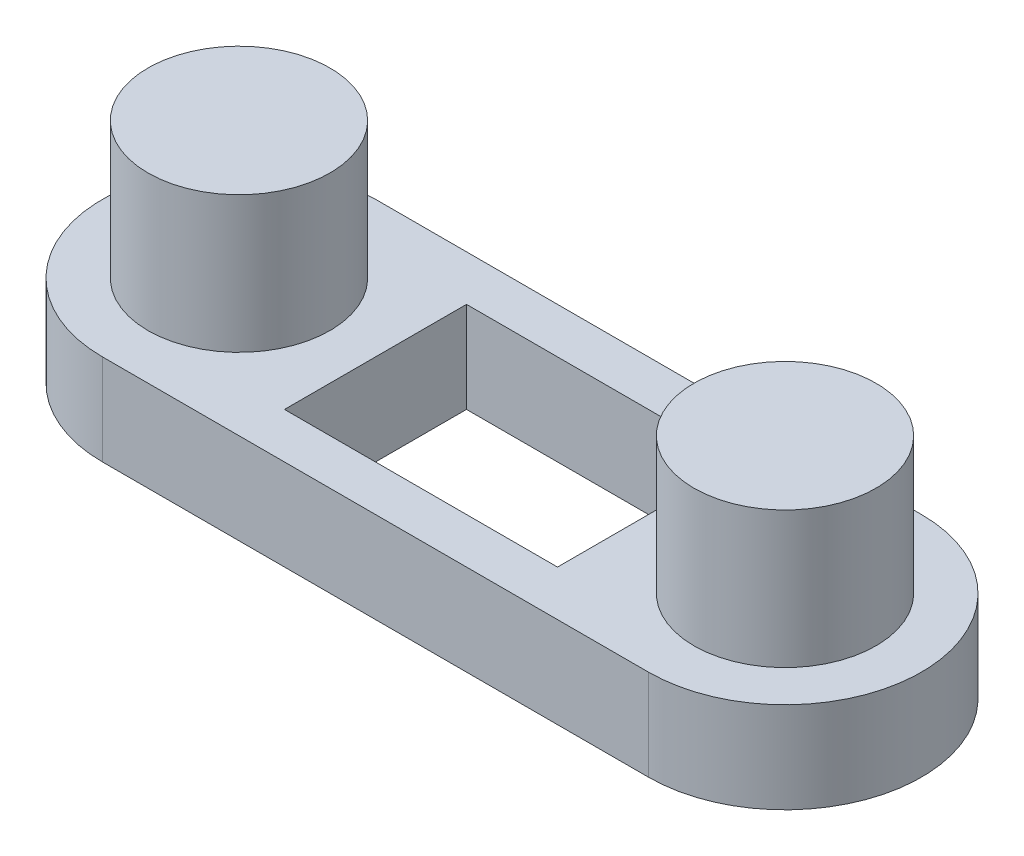
ISO-10303-21;
HEADER;
FILE_DESCRIPTION(('STEP AP214'),'2;1');
FILE_NAME('part.step','',(''),(''),'','','');
FILE_SCHEMA(('AUTOMOTIVE_DESIGN { 1 0 10303 214 1 1 1 1 }'));
ENDSEC;
DATA;
#1=APPLICATION_CONTEXT('core data for automotive mechanical design processes');
#2=APPLICATION_PROTOCOL_DEFINITION('international standard','automotive_design',2000,#1);
#3=PRODUCT_CONTEXT('',#1,'mechanical');
#4=PRODUCT('Part','Part','',(#3));
#5=PRODUCT_RELATED_PRODUCT_CATEGORY('part','',(#4));
#6=PRODUCT_DEFINITION_FORMATION('','',#4);
#7=PRODUCT_DEFINITION_CONTEXT('part definition',#1,'design');
#8=PRODUCT_DEFINITION('design','',#6,#7);
#9=PRODUCT_DEFINITION_SHAPE('','',#8);
#10=(LENGTH_UNIT() NAMED_UNIT(*) SI_UNIT(.MILLI.,.METRE.));
#11=(NAMED_UNIT(*) PLANE_ANGLE_UNIT() SI_UNIT($,.RADIAN.));
#12=(NAMED_UNIT(*) SI_UNIT($,.STERADIAN.) SOLID_ANGLE_UNIT());
#13=UNCERTAINTY_MEASURE_WITH_UNIT(LENGTH_MEASURE(1.E-05),#10,'distance_accuracy_value','');
#14=(GEOMETRIC_REPRESENTATION_CONTEXT(3) GLOBAL_UNCERTAINTY_ASSIGNED_CONTEXT((#13)) GLOBAL_UNIT_ASSIGNED_CONTEXT((#10,
#11,#12)) REPRESENTATION_CONTEXT('',''));
#15=CARTESIAN_POINT('',(0.,0.,0.));
#16=DIRECTION('',(0.,0.,1.));
#17=DIRECTION('',(1.,0.,0.));
#18=AXIS2_PLACEMENT_3D('',#15,#16,#17);
#19=CARTESIAN_POINT('',(-30.,10.,0.));
#20=DIRECTION('',(0.,-1.,0.));
#21=DIRECTION('',(0.,0.,-1.));
#22=AXIS2_PLACEMENT_3D('',#19,#20,#21);
#23=CYLINDRICAL_SURFACE('',#22,15.);
#24=CARTESIAN_POINT('',(-30.,0.,0.));
#25=DIRECTION('',(0.,1.,0.));
#26=DIRECTION('',(0.,0.,1.));
#27=AXIS2_PLACEMENT_3D('',#24,#25,#26);
#28=CIRCLE('',#27,15.);
#29=CARTESIAN_POINT('',(-30.,0.,-15.));
#30=VERTEX_POINT('',#29);
#31=CARTESIAN_POINT('',(-30.,0.,15.));
#32=VERTEX_POINT('',#31);
#33=EDGE_CURVE('E136',#30,#32,#28,.T.);
#34=ORIENTED_EDGE('',*,*,#33,.T.);
#35=DIRECTION('',(0.,-1.,0.));
#36=VECTOR('',#35,1.);
#37=CARTESIAN_POINT('',(-30.,10.,15.));
#38=LINE('',#37,#36);
#39=CARTESIAN_POINT('',(-30.,10.,15.));
#40=VERTEX_POINT('',#39);
#41=EDGE_CURVE('E11',#40,#32,#38,.T.);
#42=ORIENTED_EDGE('',*,*,#41,.F.);
#43=CARTESIAN_POINT('',(-30.,10.,0.));
#44=DIRECTION('',(0.,1.,0.));
#45=DIRECTION('',(0.,0.,1.));
#46=AXIS2_PLACEMENT_3D('',#43,#44,#45);
#47=CIRCLE('',#46,15.);
#48=CARTESIAN_POINT('',(-30.,10.,-15.));
#49=VERTEX_POINT('',#48);
#50=EDGE_CURVE('E140',#49,#40,#47,.T.);
#51=ORIENTED_EDGE('',*,*,#50,.F.);
#52=DIRECTION('',(0.,-1.,0.));
#53=VECTOR('',#52,1.);
#54=CARTESIAN_POINT('',(-30.,10.,-15.));
#55=LINE('',#54,#53);
#56=EDGE_CURVE('E150',#49,#30,#55,.T.);
#57=ORIENTED_EDGE('',*,*,#56,.T.);
#58=EDGE_LOOP('',(#34,#42,#51,#57));
#59=FACE_BOUND('',#58,.T.);
#60=ADVANCED_FACE('F35',(#59),#23,.T.);
#61=CARTESIAN_POINT('',(30.,10.,15.));
#62=DIRECTION('',(0.,0.,-1.));
#63=DIRECTION('',(-1.,0.,0.));
#64=AXIS2_PLACEMENT_3D('',#61,#62,#63);
#65=PLANE('',#64);
#66=DIRECTION('',(1.,0.,0.));
#67=VECTOR('',#66,1.);
#68=CARTESIAN_POINT('',(30.,0.,15.));
#69=LINE('',#68,#67);
#70=CARTESIAN_POINT('',(30.,0.,15.));
#71=VERTEX_POINT('',#70);
#72=EDGE_CURVE('E153',#32,#71,#69,.T.);
#73=ORIENTED_EDGE('',*,*,#72,.T.);
#74=DIRECTION('',(0.,-1.,0.));
#75=VECTOR('',#74,1.);
#76=CARTESIAN_POINT('',(30.,10.,15.));
#77=LINE('',#76,#75);
#78=CARTESIAN_POINT('',(30.,10.,15.));
#79=VERTEX_POINT('',#78);
#80=EDGE_CURVE('E42',#79,#71,#77,.T.);
#81=ORIENTED_EDGE('',*,*,#80,.F.);
#82=DIRECTION('',(1.,0.,0.));
#83=VECTOR('',#82,1.);
#84=CARTESIAN_POINT('',(30.,10.,15.));
#85=LINE('',#84,#83);
#86=EDGE_CURVE('E143',#40,#79,#85,.T.);
#87=ORIENTED_EDGE('',*,*,#86,.F.);
#88=ORIENTED_EDGE('',*,*,#41,.T.);
#89=EDGE_LOOP('',(#73,#81,#87,#88));
#90=FACE_BOUND('',#89,.T.);
#91=ADVANCED_FACE('F181',(#90),#65,.F.);
#92=CARTESIAN_POINT('',(30.,10.,0.));
#93=DIRECTION('',(0.,-1.,0.));
#94=DIRECTION('',(0.,0.,-1.));
#95=AXIS2_PLACEMENT_3D('',#92,#93,#94);
#96=CYLINDRICAL_SURFACE('',#95,15.);
#97=CARTESIAN_POINT('',(30.,0.,0.));
#98=DIRECTION('',(0.,1.,0.));
#99=DIRECTION('',(0.,0.,1.));
#100=AXIS2_PLACEMENT_3D('',#97,#98,#99);
#101=CIRCLE('',#100,15.);
#102=CARTESIAN_POINT('',(30.,0.,-15.));
#103=VERTEX_POINT('',#102);
#104=EDGE_CURVE('E155',#71,#103,#101,.T.);
#105=ORIENTED_EDGE('',*,*,#104,.T.);
#106=DIRECTION('',(0.,-1.,0.));
#107=VECTOR('',#106,1.);
#108=CARTESIAN_POINT('',(30.,10.,-15.));
#109=LINE('',#108,#107);
#110=CARTESIAN_POINT('',(30.,10.,-15.));
#111=VERTEX_POINT('',#110);
#112=EDGE_CURVE('E160',#111,#103,#109,.T.);
#113=ORIENTED_EDGE('',*,*,#112,.F.);
#114=CARTESIAN_POINT('',(30.,10.,0.));
#115=DIRECTION('',(0.,1.,0.));
#116=DIRECTION('',(0.,0.,1.));
#117=AXIS2_PLACEMENT_3D('',#114,#115,#116);
#118=CIRCLE('',#117,15.);
#119=EDGE_CURVE('E146',#79,#111,#118,.T.);
#120=ORIENTED_EDGE('',*,*,#119,.F.);
#121=ORIENTED_EDGE('',*,*,#80,.T.);
#122=EDGE_LOOP('',(#105,#113,#120,#121));
#123=FACE_BOUND('',#122,.T.);
#124=ADVANCED_FACE('F167',(#123),#96,.T.);
#125=CARTESIAN_POINT('',(30.,10.,-15.));
#126=DIRECTION('',(0.,0.,1.));
#127=DIRECTION('',(1.,0.,0.));
#128=AXIS2_PLACEMENT_3D('',#125,#126,#127);
#129=PLANE('',#128);
#130=DIRECTION('',(-1.,0.,0.));
#131=VECTOR('',#130,1.);
#132=CARTESIAN_POINT('',(30.,0.,-15.));
#133=LINE('',#132,#131);
#134=EDGE_CURVE('E144',#103,#30,#133,.T.);
#135=ORIENTED_EDGE('',*,*,#134,.T.);
#136=ORIENTED_EDGE('',*,*,#56,.F.);
#137=DIRECTION('',(-1.,0.,0.));
#138=VECTOR('',#137,1.);
#139=CARTESIAN_POINT('',(30.,10.,-15.));
#140=LINE('',#139,#138);
#141=EDGE_CURVE('E148',#111,#49,#140,.T.);
#142=ORIENTED_EDGE('',*,*,#141,.F.);
#143=ORIENTED_EDGE('',*,*,#112,.T.);
#144=EDGE_LOOP('',(#135,#136,#142,#143));
#145=FACE_BOUND('',#144,.T.);
#146=ADVANCED_FACE('F174',(#145),#129,.F.);
#147=CARTESIAN_POINT('',(-30.,10.,0.));
#148=DIRECTION('',(0.,1.,0.));
#149=DIRECTION('',(0.,0.,1.));
#150=AXIS2_PLACEMENT_3D('',#147,#148,#149);
#151=PLANE('',#150);
#152=CARTESIAN_POINT('',(-30.,10.,0.));
#153=DIRECTION('',(0.,1.,0.));
#154=DIRECTION('',(0.,0.,1.));
#155=AXIS2_PLACEMENT_3D('',#152,#153,#154);
#156=CIRCLE('',#155,9.99999999999999);
#157=CARTESIAN_POINT('',(-30.,10.,10.));
#158=VERTEX_POINT('',#157);
#159=EDGE_CURVE('E227',#158,#158,#156,.T.);
#160=ORIENTED_EDGE('',*,*,#159,.F.);
#161=EDGE_LOOP('',(#160));
#162=FACE_BOUND('',#161,.T.);
#163=CARTESIAN_POINT('',(30.,10.,0.));
#164=DIRECTION('',(0.,1.,0.));
#165=DIRECTION('',(0.,0.,1.));
#166=AXIS2_PLACEMENT_3D('',#163,#164,#165);
#167=CIRCLE('',#166,10.);
#168=CARTESIAN_POINT('',(30.,10.,9.99999999999999));
#169=VERTEX_POINT('',#168);
#170=EDGE_CURVE('E123',#169,#169,#167,.T.);
#171=ORIENTED_EDGE('',*,*,#170,.F.);
#172=EDGE_LOOP('',(#171));
#173=FACE_BOUND('',#172,.T.);
#174=DIRECTION('',(0.,0.,1.));
#175=VECTOR('',#174,1.);
#176=CARTESIAN_POINT('',(-15.,10.,10.));
#177=LINE('',#176,#175);
#178=CARTESIAN_POINT('',(-15.,10.,-10.));
#179=VERTEX_POINT('',#178);
#180=CARTESIAN_POINT('',(-15.,10.,10.));
#181=VERTEX_POINT('',#180);
#182=EDGE_CURVE('E49',#179,#181,#177,.T.);
#183=ORIENTED_EDGE('',*,*,#182,.F.);
#184=DIRECTION('',(-1.,0.,0.));
#185=VECTOR('',#184,1.);
#186=CARTESIAN_POINT('',(15.,10.,-10.));
#187=LINE('',#186,#185);
#188=CARTESIAN_POINT('',(15.,10.,-10.));
#189=VERTEX_POINT('',#188);
#190=EDGE_CURVE('E117',#189,#179,#187,.T.);
#191=ORIENTED_EDGE('',*,*,#190,.F.);
#192=DIRECTION('',(0.,0.,-1.));
#193=VECTOR('',#192,1.);
#194=CARTESIAN_POINT('',(15.,10.,10.));
#195=LINE('',#194,#193);
#196=CARTESIAN_POINT('',(15.,10.,10.));
#197=VERTEX_POINT('',#196);
#198=EDGE_CURVE('E120',#197,#189,#195,.T.);
#199=ORIENTED_EDGE('',*,*,#198,.F.);
#200=DIRECTION('',(1.,0.,0.));
#201=VECTOR('',#200,1.);
#202=CARTESIAN_POINT('',(15.,10.,10.));
#203=LINE('',#202,#201);
#204=EDGE_CURVE('E129',#181,#197,#203,.T.);
#205=ORIENTED_EDGE('',*,*,#204,.F.);
#206=EDGE_LOOP('',(#183,#191,#199,#205));
#207=FACE_BOUND('',#206,.T.);
#208=ORIENTED_EDGE('',*,*,#50,.T.);
#209=ORIENTED_EDGE('',*,*,#86,.T.);
#210=ORIENTED_EDGE('',*,*,#119,.T.);
#211=ORIENTED_EDGE('',*,*,#141,.T.);
#212=EDGE_LOOP('',(#208,#209,#210,#211));
#213=FACE_BOUND('',#212,.T.);
#214=ADVANCED_FACE('F180',(#162,#173,#207,#213),#151,.T.);
#215=CARTESIAN_POINT('',(-30.,0.,0.));
#216=DIRECTION('',(0.,1.,0.));
#217=DIRECTION('',(0.,0.,1.));
#218=AXIS2_PLACEMENT_3D('',#215,#216,#217);
#219=PLANE('',#218);
#220=DIRECTION('',(-1.,0.,0.));
#221=VECTOR('',#220,1.);
#222=CARTESIAN_POINT('',(15.,0.,-10.));
#223=LINE('',#222,#221);
#224=CARTESIAN_POINT('',(15.,0.,-10.));
#225=VERTEX_POINT('',#224);
#226=CARTESIAN_POINT('',(-15.,0.,-10.));
#227=VERTEX_POINT('',#226);
#228=EDGE_CURVE('E107',#225,#227,#223,.T.);
#229=ORIENTED_EDGE('',*,*,#228,.T.);
#230=DIRECTION('',(0.,0.,1.));
#231=VECTOR('',#230,1.);
#232=CARTESIAN_POINT('',(-15.,0.,10.));
#233=LINE('',#232,#231);
#234=CARTESIAN_POINT('',(-15.,0.,10.));
#235=VERTEX_POINT('',#234);
#236=EDGE_CURVE('E101',#227,#235,#233,.T.);
#237=ORIENTED_EDGE('',*,*,#236,.T.);
#238=DIRECTION('',(1.,0.,0.));
#239=VECTOR('',#238,1.);
#240=CARTESIAN_POINT('',(15.,0.,10.));
#241=LINE('',#240,#239);
#242=CARTESIAN_POINT('',(15.,0.,10.));
#243=VERTEX_POINT('',#242);
#244=EDGE_CURVE('E110',#235,#243,#241,.T.);
#245=ORIENTED_EDGE('',*,*,#244,.T.);
#246=DIRECTION('',(0.,0.,-1.));
#247=VECTOR('',#246,1.);
#248=CARTESIAN_POINT('',(15.,0.,10.));
#249=LINE('',#248,#247);
#250=EDGE_CURVE('E57',#243,#225,#249,.T.);
#251=ORIENTED_EDGE('',*,*,#250,.T.);
#252=EDGE_LOOP('',(#229,#237,#245,#251));
#253=FACE_BOUND('',#252,.T.);
#254=ORIENTED_EDGE('',*,*,#33,.F.);
#255=ORIENTED_EDGE('',*,*,#134,.F.);
#256=ORIENTED_EDGE('',*,*,#104,.F.);
#257=ORIENTED_EDGE('',*,*,#72,.F.);
#258=EDGE_LOOP('',(#254,#255,#256,#257));
#259=FACE_BOUND('',#258,.T.);
#260=ADVANCED_FACE('F114',(#253,#259),#219,.F.);
#261=CARTESIAN_POINT('',(-15.,0.,10.));
#262=DIRECTION('',(-1.,0.,0.));
#263=DIRECTION('',(0.,0.,1.));
#264=AXIS2_PLACEMENT_3D('',#261,#262,#263);
#265=PLANE('',#264);
#266=ORIENTED_EDGE('',*,*,#182,.T.);
#267=DIRECTION('',(0.,1.,0.));
#268=VECTOR('',#267,1.);
#269=CARTESIAN_POINT('',(-15.,0.,10.));
#270=LINE('',#269,#268);
#271=EDGE_CURVE('E97',#235,#181,#270,.T.);
#272=ORIENTED_EDGE('',*,*,#271,.F.);
#273=ORIENTED_EDGE('',*,*,#236,.F.);
#274=DIRECTION('',(0.,1.,0.));
#275=VECTOR('',#274,1.);
#276=CARTESIAN_POINT('',(-15.,0.,-10.));
#277=LINE('',#276,#275);
#278=EDGE_CURVE('E134',#227,#179,#277,.T.);
#279=ORIENTED_EDGE('',*,*,#278,.T.);
#280=EDGE_LOOP('',(#266,#272,#273,#279));
#281=FACE_BOUND('',#280,.T.);
#282=ADVANCED_FACE('F99',(#281),#265,.F.);
#283=CARTESIAN_POINT('',(15.,0.,-10.));
#284=DIRECTION('',(0.,0.,-1.));
#285=DIRECTION('',(-1.,0.,0.));
#286=AXIS2_PLACEMENT_3D('',#283,#284,#285);
#287=PLANE('',#286);
#288=ORIENTED_EDGE('',*,*,#190,.T.);
#289=ORIENTED_EDGE('',*,*,#278,.F.);
#290=ORIENTED_EDGE('',*,*,#228,.F.);
#291=DIRECTION('',(0.,1.,0.));
#292=VECTOR('',#291,1.);
#293=CARTESIAN_POINT('',(15.,0.,-10.));
#294=LINE('',#293,#292);
#295=EDGE_CURVE('E137',#225,#189,#294,.T.);
#296=ORIENTED_EDGE('',*,*,#295,.T.);
#297=EDGE_LOOP('',(#288,#289,#290,#296));
#298=FACE_BOUND('',#297,.T.);
#299=ADVANCED_FACE('F198',(#298),#287,.F.);
#300=CARTESIAN_POINT('',(15.,0.,10.));
#301=DIRECTION('',(1.,0.,0.));
#302=DIRECTION('',(0.,0.,-1.));
#303=AXIS2_PLACEMENT_3D('',#300,#301,#302);
#304=PLANE('',#303);
#305=ORIENTED_EDGE('',*,*,#198,.T.);
#306=ORIENTED_EDGE('',*,*,#295,.F.);
#307=ORIENTED_EDGE('',*,*,#250,.F.);
#308=DIRECTION('',(0.,1.,0.));
#309=VECTOR('',#308,1.);
#310=CARTESIAN_POINT('',(15.,0.,10.));
#311=LINE('',#310,#309);
#312=EDGE_CURVE('E106',#243,#197,#311,.T.);
#313=ORIENTED_EDGE('',*,*,#312,.T.);
#314=EDGE_LOOP('',(#305,#306,#307,#313));
#315=FACE_BOUND('',#314,.T.);
#316=ADVANCED_FACE('F202',(#315),#304,.F.);
#317=CARTESIAN_POINT('',(15.,0.,10.));
#318=DIRECTION('',(0.,0.,1.));
#319=DIRECTION('',(1.,0.,0.));
#320=AXIS2_PLACEMENT_3D('',#317,#318,#319);
#321=PLANE('',#320);
#322=ORIENTED_EDGE('',*,*,#204,.T.);
#323=ORIENTED_EDGE('',*,*,#312,.F.);
#324=ORIENTED_EDGE('',*,*,#244,.F.);
#325=ORIENTED_EDGE('',*,*,#271,.T.);
#326=EDGE_LOOP('',(#322,#323,#324,#325));
#327=FACE_BOUND('',#326,.T.);
#328=ADVANCED_FACE('F111',(#327),#321,.F.);
#329=CARTESIAN_POINT('',(30.,25.,0.));
#330=DIRECTION('',(0.,-1.,0.));
#331=DIRECTION('',(0.,0.,-1.));
#332=AXIS2_PLACEMENT_3D('',#329,#330,#331);
#333=CYLINDRICAL_SURFACE('',#332,10.);
#334=CARTESIAN_POINT('',(30.,25.,0.));
#335=DIRECTION('',(0.,1.,0.));
#336=DIRECTION('',(0.,0.,1.));
#337=AXIS2_PLACEMENT_3D('',#334,#335,#336);
#338=CIRCLE('',#337,10.);
#339=CARTESIAN_POINT('',(30.,25.,9.99999999999999));
#340=VERTEX_POINT('',#339);
#341=EDGE_CURVE('E130',#340,#340,#338,.T.);
#342=ORIENTED_EDGE('',*,*,#341,.F.);
#343=EDGE_LOOP('',(#342));
#344=FACE_BOUND('',#343,.T.);
#345=ORIENTED_EDGE('',*,*,#170,.T.);
#346=EDGE_LOOP('',(#345));
#347=FACE_BOUND('',#346,.T.);
#348=ADVANCED_FACE('F201',(#344,#347),#333,.T.);
#349=CARTESIAN_POINT('',(30.,25.,0.));
#350=DIRECTION('',(0.,1.,0.));
#351=DIRECTION('',(0.,0.,1.));
#352=AXIS2_PLACEMENT_3D('',#349,#350,#351);
#353=PLANE('',#352);
#354=ORIENTED_EDGE('',*,*,#341,.T.);
#355=EDGE_LOOP('',(#354));
#356=FACE_BOUND('',#355,.T.);
#357=ADVANCED_FACE('F210',(#356),#353,.T.);
#358=CARTESIAN_POINT('',(-30.,25.,0.));
#359=DIRECTION('',(0.,-1.,0.));
#360=DIRECTION('',(0.,0.,-1.));
#361=AXIS2_PLACEMENT_3D('',#358,#359,#360);
#362=CYLINDRICAL_SURFACE('',#361,9.99999999999999);
#363=CARTESIAN_POINT('',(-30.,25.,0.));
#364=DIRECTION('',(0.,1.,0.));
#365=DIRECTION('',(0.,0.,1.));
#366=AXIS2_PLACEMENT_3D('',#363,#364,#365);
#367=CIRCLE('',#366,9.99999999999999);
#368=CARTESIAN_POINT('',(-30.,25.,10.));
#369=VERTEX_POINT('',#368);
#370=EDGE_CURVE('E226',#369,#369,#367,.T.);
#371=ORIENTED_EDGE('',*,*,#370,.F.);
#372=EDGE_LOOP('',(#371));
#373=FACE_BOUND('',#372,.T.);
#374=ORIENTED_EDGE('',*,*,#159,.T.);
#375=EDGE_LOOP('',(#374));
#376=FACE_BOUND('',#375,.T.);
#377=ADVANCED_FACE('F214',(#373,#376),#362,.T.);
#378=CARTESIAN_POINT('',(-30.,25.,0.));
#379=DIRECTION('',(0.,1.,0.));
#380=DIRECTION('',(0.,0.,1.));
#381=AXIS2_PLACEMENT_3D('',#378,#379,#380);
#382=PLANE('',#381);
#383=ORIENTED_EDGE('',*,*,#370,.T.);
#384=EDGE_LOOP('',(#383));
#385=FACE_BOUND('',#384,.T.);
#386=ADVANCED_FACE('F218',(#385),#382,.T.);
#387=CLOSED_SHELL('',(#60,#91,#124,#146,#214,#260,#282,#299,#316,#328,#348,#357,#377,#386));
#388=MANIFOLD_SOLID_BREP('B2',#387);
#389=ADVANCED_BREP_SHAPE_REPRESENTATION('',(#18,#388),#14);
#390=SHAPE_DEFINITION_REPRESENTATION(#9,#389);
ENDSEC;
END-ISO-10303-21;
